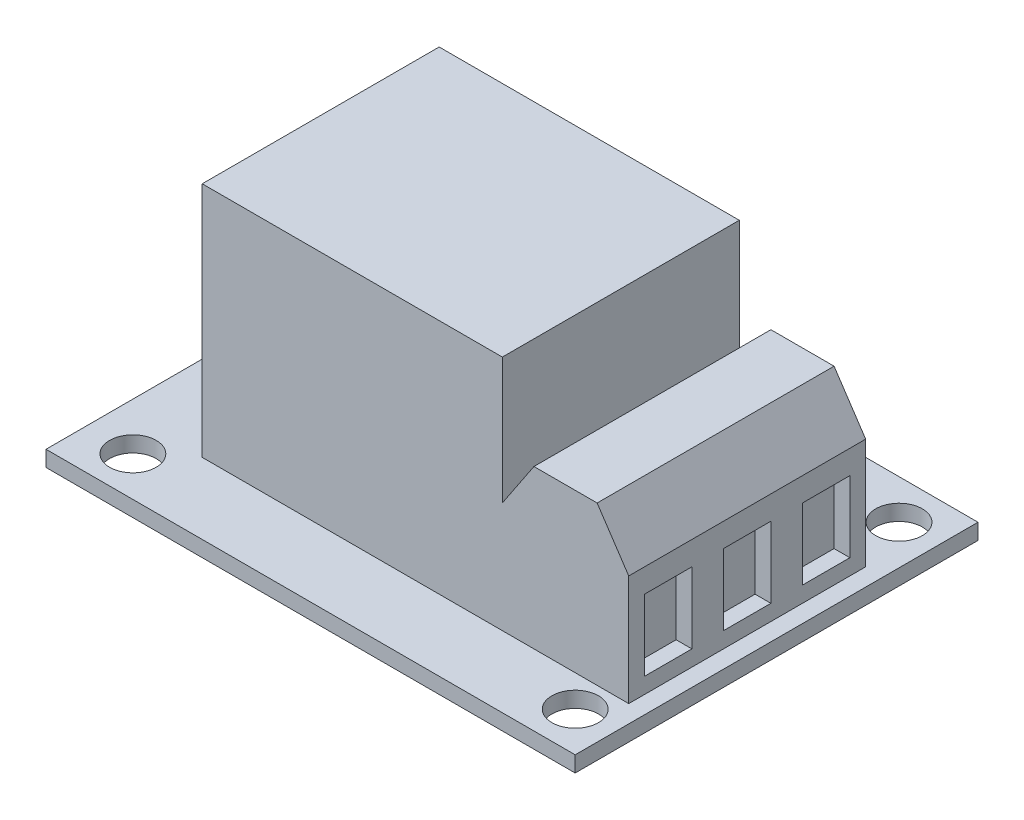
ISO-10303-21;
HEADER;
FILE_DESCRIPTION(('STEP AP214'),'2;1');
FILE_NAME('part.step','',(''),(''),'','','');
FILE_SCHEMA(('AUTOMOTIVE_DESIGN { 1 0 10303 214 1 1 1 1 }'));
ENDSEC;
DATA;
#1=APPLICATION_CONTEXT('core data for automotive mechanical design processes');
#2=APPLICATION_PROTOCOL_DEFINITION('international standard','automotive_design',2000,#1);
#3=PRODUCT_CONTEXT('',#1,'mechanical');
#4=PRODUCT('Part','Part','',(#3));
#5=PRODUCT_RELATED_PRODUCT_CATEGORY('part','',(#4));
#6=PRODUCT_DEFINITION_FORMATION('','',#4);
#7=PRODUCT_DEFINITION_CONTEXT('part definition',#1,'design');
#8=PRODUCT_DEFINITION('design','',#6,#7);
#9=PRODUCT_DEFINITION_SHAPE('','',#8);
#10=(LENGTH_UNIT() NAMED_UNIT(*) SI_UNIT(.MILLI.,.METRE.));
#11=(NAMED_UNIT(*) PLANE_ANGLE_UNIT() SI_UNIT($,.RADIAN.));
#12=(NAMED_UNIT(*) SI_UNIT($,.STERADIAN.) SOLID_ANGLE_UNIT());
#13=UNCERTAINTY_MEASURE_WITH_UNIT(LENGTH_MEASURE(1.E-05),#10,'distance_accuracy_value','');
#14=(GEOMETRIC_REPRESENTATION_CONTEXT(3) GLOBAL_UNCERTAINTY_ASSIGNED_CONTEXT((#13)) GLOBAL_UNIT_ASSIGNED_CONTEXT((#10,
#11,#12)) REPRESENTATION_CONTEXT('',''));
#15=CARTESIAN_POINT('',(0.,0.,0.));
#16=DIRECTION('',(0.,0.,1.));
#17=DIRECTION('',(1.,0.,0.));
#18=AXIS2_PLACEMENT_3D('',#15,#16,#17);
#19=CARTESIAN_POINT('',(11.363042600397,-1.,0.));
#20=DIRECTION('',(-1.,0.,0.));
#21=DIRECTION('',(0.,0.,1.));
#22=AXIS2_PLACEMENT_3D('',#19,#20,#21);
#23=PLANE('',#22);
#24=DIRECTION('',(0.,0.,1.));
#25=VECTOR('',#24,1.);
#26=CARTESIAN_POINT('',(11.363042600397,0.,0.));
#27=LINE('',#26,#25);
#28=CARTESIAN_POINT('',(11.363042600397,0.,-17.0606557377049));
#29=VERTEX_POINT('',#28);
#30=CARTESIAN_POINT('',(11.363042600397,0.,8.43934426229508));
#31=VERTEX_POINT('',#30);
#32=EDGE_CURVE('E454',#29,#31,#27,.T.);
#33=ORIENTED_EDGE('',*,*,#32,.T.);
#34=DIRECTION('',(0.,1.,0.));
#35=VECTOR('',#34,1.);
#36=CARTESIAN_POINT('',(11.363042600397,-1.,8.43934426229508));
#37=LINE('',#36,#35);
#38=CARTESIAN_POINT('',(11.363042600397,-1.,8.43934426229508));
#39=VERTEX_POINT('',#38);
#40=EDGE_CURVE('E468',#39,#31,#37,.T.);
#41=ORIENTED_EDGE('',*,*,#40,.F.);
#42=DIRECTION('',(0.,0.,1.));
#43=VECTOR('',#42,1.);
#44=CARTESIAN_POINT('',(11.363042600397,-1.,0.));
#45=LINE('',#44,#43);
#46=CARTESIAN_POINT('',(11.363042600397,-1.,-17.0606557377049));
#47=VERTEX_POINT('',#46);
#48=EDGE_CURVE('E424',#47,#39,#45,.T.);
#49=ORIENTED_EDGE('',*,*,#48,.F.);
#50=DIRECTION('',(0.,1.,0.));
#51=VECTOR('',#50,1.);
#52=CARTESIAN_POINT('',(11.363042600397,-1.,-17.0606557377049));
#53=LINE('',#52,#51);
#54=EDGE_CURVE('E438',#47,#29,#53,.T.);
#55=ORIENTED_EDGE('',*,*,#54,.T.);
#56=EDGE_LOOP('',(#33,#41,#49,#55));
#57=FACE_BOUND('',#56,.T.);
#58=ADVANCED_FACE('F43',(#57),#23,.F.);
#59=CARTESIAN_POINT('',(0.,-1.,8.43934426229508));
#60=DIRECTION('',(0.,0.,1.));
#61=DIRECTION('',(1.,0.,0.));
#62=AXIS2_PLACEMENT_3D('',#59,#60,#61);
#63=PLANE('',#62);
#64=DIRECTION('',(1.,0.,0.));
#65=VECTOR('',#64,1.);
#66=CARTESIAN_POINT('',(0.,0.,8.43934426229508));
#67=LINE('',#66,#65);
#68=CARTESIAN_POINT('',(-22.136957399603,0.,8.43934426229508));
#69=VERTEX_POINT('',#68);
#70=EDGE_CURVE('E412',#69,#31,#67,.T.);
#71=ORIENTED_EDGE('',*,*,#70,.F.);
#72=DIRECTION('',(0.,1.,0.));
#73=VECTOR('',#72,1.);
#74=CARTESIAN_POINT('',(-22.136957399603,-1.,8.43934426229508));
#75=LINE('',#74,#73);
#76=CARTESIAN_POINT('',(-22.136957399603,-1.,8.43934426229508));
#77=VERTEX_POINT('',#76);
#78=EDGE_CURVE('E472',#77,#69,#75,.T.);
#79=ORIENTED_EDGE('',*,*,#78,.F.);
#80=DIRECTION('',(1.,0.,0.));
#81=VECTOR('',#80,1.);
#82=CARTESIAN_POINT('',(0.,-1.,8.43934426229508));
#83=LINE('',#82,#81);
#84=EDGE_CURVE('E434',#77,#39,#83,.T.);
#85=ORIENTED_EDGE('',*,*,#84,.T.);
#86=ORIENTED_EDGE('',*,*,#40,.T.);
#87=EDGE_LOOP('',(#71,#79,#85,#86));
#88=FACE_BOUND('',#87,.T.);
#89=ADVANCED_FACE('F529',(#88),#63,.T.);
#90=CARTESIAN_POINT('',(-22.136957399603,-1.,0.));
#91=DIRECTION('',(-1.,0.,0.));
#92=DIRECTION('',(0.,0.,1.));
#93=AXIS2_PLACEMENT_3D('',#90,#91,#92);
#94=PLANE('',#93);
#95=DIRECTION('',(0.,0.,1.));
#96=VECTOR('',#95,1.);
#97=CARTESIAN_POINT('',(-22.136957399603,0.,0.));
#98=LINE('',#97,#96);
#99=CARTESIAN_POINT('',(-22.136957399603,0.,-17.0606557377049));
#100=VERTEX_POINT('',#99);
#101=EDGE_CURVE('E461',#100,#69,#98,.T.);
#102=ORIENTED_EDGE('',*,*,#101,.F.);
#103=DIRECTION('',(0.,1.,0.));
#104=VECTOR('',#103,1.);
#105=CARTESIAN_POINT('',(-22.136957399603,-1.,-17.0606557377049));
#106=LINE('',#105,#104);
#107=CARTESIAN_POINT('',(-22.136957399603,-1.,-17.0606557377049));
#108=VERTEX_POINT('',#107);
#109=EDGE_CURVE('E475',#108,#100,#106,.T.);
#110=ORIENTED_EDGE('',*,*,#109,.F.);
#111=DIRECTION('',(0.,0.,1.));
#112=VECTOR('',#111,1.);
#113=CARTESIAN_POINT('',(-22.136957399603,-1.,0.));
#114=LINE('',#113,#112);
#115=EDGE_CURVE('E430',#108,#77,#114,.T.);
#116=ORIENTED_EDGE('',*,*,#115,.T.);
#117=ORIENTED_EDGE('',*,*,#78,.T.);
#118=EDGE_LOOP('',(#102,#110,#116,#117));
#119=FACE_BOUND('',#118,.T.);
#120=ADVANCED_FACE('F535',(#119),#94,.T.);
#121=CARTESIAN_POINT('',(-19.136957399603,-1.,5.93934426229508));
#122=DIRECTION('',(0.,1.,0.));
#123=DIRECTION('',(0.,0.,1.));
#124=AXIS2_PLACEMENT_3D('',#121,#122,#123);
#125=CYLINDRICAL_SURFACE('',#124,1.475);
#126=CARTESIAN_POINT('',(-19.136957399603,-1.,5.93934426229508));
#127=DIRECTION('',(0.,1.,0.));
#128=DIRECTION('',(0.,0.,1.));
#129=AXIS2_PLACEMENT_3D('',#126,#127,#128);
#130=CIRCLE('',#129,1.475);
#131=CARTESIAN_POINT('',(-19.136957399603,-1.,7.41434426229508));
#132=VERTEX_POINT('',#131);
#133=EDGE_CURVE('E420',#132,#132,#130,.T.);
#134=ORIENTED_EDGE('',*,*,#133,.F.);
#135=EDGE_LOOP('',(#134));
#136=FACE_BOUND('',#135,.T.);
#137=CARTESIAN_POINT('',(-19.136957399603,0.,5.93934426229508));
#138=DIRECTION('',(0.,1.,0.));
#139=DIRECTION('',(0.,0.,1.));
#140=AXIS2_PLACEMENT_3D('',#137,#138,#139);
#141=CIRCLE('',#140,1.475);
#142=CARTESIAN_POINT('',(-19.136957399603,0.,7.41434426229508));
#143=VERTEX_POINT('',#142);
#144=EDGE_CURVE('E450',#143,#143,#141,.T.);
#145=ORIENTED_EDGE('',*,*,#144,.T.);
#146=EDGE_LOOP('',(#145));
#147=FACE_BOUND('',#146,.T.);
#148=ADVANCED_FACE('F542',(#136,#147),#125,.F.);
#149=CARTESIAN_POINT('',(-19.136957399603,-1.,-14.5606557377049));
#150=DIRECTION('',(0.,1.,0.));
#151=DIRECTION('',(0.,0.,1.));
#152=AXIS2_PLACEMENT_3D('',#149,#150,#151);
#153=CYLINDRICAL_SURFACE('',#152,1.475);
#154=CARTESIAN_POINT('',(-19.136957399603,-1.,-14.5606557377049));
#155=DIRECTION('',(0.,1.,0.));
#156=DIRECTION('',(0.,0.,1.));
#157=AXIS2_PLACEMENT_3D('',#154,#155,#156);
#158=CIRCLE('',#157,1.475);
#159=CARTESIAN_POINT('',(-19.136957399603,-1.,-13.0856557377049));
#160=VERTEX_POINT('',#159);
#161=EDGE_CURVE('E416',#160,#160,#158,.T.);
#162=ORIENTED_EDGE('',*,*,#161,.F.);
#163=EDGE_LOOP('',(#162));
#164=FACE_BOUND('',#163,.T.);
#165=CARTESIAN_POINT('',(-19.136957399603,0.,-14.5606557377049));
#166=DIRECTION('',(0.,1.,0.));
#167=DIRECTION('',(0.,0.,1.));
#168=AXIS2_PLACEMENT_3D('',#165,#166,#167);
#169=CIRCLE('',#168,1.475);
#170=CARTESIAN_POINT('',(-19.136957399603,0.,-13.0856557377049));
#171=VERTEX_POINT('',#170);
#172=EDGE_CURVE('E446',#171,#171,#169,.T.);
#173=ORIENTED_EDGE('',*,*,#172,.T.);
#174=EDGE_LOOP('',(#173));
#175=FACE_BOUND('',#174,.T.);
#176=ADVANCED_FACE('F545',(#164,#175),#153,.F.);
#177=CARTESIAN_POINT('',(8.86304260039704,-1.,5.93934426229508));
#178=DIRECTION('',(0.,1.,0.));
#179=DIRECTION('',(0.,0.,1.));
#180=AXIS2_PLACEMENT_3D('',#177,#178,#179);
#181=CYLINDRICAL_SURFACE('',#180,1.47500000000108);
#182=CARTESIAN_POINT('',(8.86304260039704,-1.,5.93934426229508));
#183=DIRECTION('',(0.,1.,0.));
#184=DIRECTION('',(0.,0.,1.));
#185=AXIS2_PLACEMENT_3D('',#182,#183,#184);
#186=CIRCLE('',#185,1.47500000000108);
#187=CARTESIAN_POINT('',(8.86304260039704,-1.,7.41434426229616));
#188=VERTEX_POINT('',#187);
#189=EDGE_CURVE('E411',#188,#188,#186,.T.);
#190=ORIENTED_EDGE('',*,*,#189,.F.);
#191=EDGE_LOOP('',(#190));
#192=FACE_BOUND('',#191,.T.);
#193=CARTESIAN_POINT('',(8.86304260039704,0.,5.93934426229508));
#194=DIRECTION('',(0.,1.,0.));
#195=DIRECTION('',(0.,0.,1.));
#196=AXIS2_PLACEMENT_3D('',#193,#194,#195);
#197=CIRCLE('',#196,1.47500000000108);
#198=CARTESIAN_POINT('',(8.86304260039704,0.,7.41434426229616));
#199=VERTEX_POINT('',#198);
#200=EDGE_CURVE('E442',#199,#199,#197,.T.);
#201=ORIENTED_EDGE('',*,*,#200,.T.);
#202=EDGE_LOOP('',(#201));
#203=FACE_BOUND('',#202,.T.);
#204=ADVANCED_FACE('F549',(#192,#203),#181,.F.);
#205=CARTESIAN_POINT('',(8.86304260039704,-1.,-14.5606557377049));
#206=DIRECTION('',(0.,1.,0.));
#207=DIRECTION('',(0.,0.,1.));
#208=AXIS2_PLACEMENT_3D('',#205,#206,#207);
#209=CYLINDRICAL_SURFACE('',#208,1.47500000000085);
#210=CARTESIAN_POINT('',(8.86304260039704,-1.,-14.5606557377049));
#211=DIRECTION('',(0.,1.,0.));
#212=DIRECTION('',(0.,0.,1.));
#213=AXIS2_PLACEMENT_3D('',#210,#211,#212);
#214=CIRCLE('',#213,1.47500000000085);
#215=CARTESIAN_POINT('',(8.86304260039704,-1.,-13.0856557377041));
#216=VERTEX_POINT('',#215);
#217=EDGE_CURVE('E407',#216,#216,#214,.T.);
#218=ORIENTED_EDGE('',*,*,#217,.F.);
#219=EDGE_LOOP('',(#218));
#220=FACE_BOUND('',#219,.T.);
#221=CARTESIAN_POINT('',(8.86304260039704,0.,-14.5606557377049));
#222=DIRECTION('',(0.,1.,0.));
#223=DIRECTION('',(0.,0.,1.));
#224=AXIS2_PLACEMENT_3D('',#221,#222,#223);
#225=CIRCLE('',#224,1.47500000000085);
#226=CARTESIAN_POINT('',(8.86304260039704,0.,-13.0856557377041));
#227=VERTEX_POINT('',#226);
#228=EDGE_CURVE('E406',#227,#227,#225,.T.);
#229=ORIENTED_EDGE('',*,*,#228,.T.);
#230=EDGE_LOOP('',(#229));
#231=FACE_BOUND('',#230,.T.);
#232=ADVANCED_FACE('F552',(#220,#231),#209,.F.);
#233=CARTESIAN_POINT('',(0.,-1.,-17.0606557377049));
#234=DIRECTION('',(0.,0.,1.));
#235=DIRECTION('',(1.,0.,0.));
#236=AXIS2_PLACEMENT_3D('',#233,#234,#235);
#237=PLANE('',#236);
#238=DIRECTION('',(1.,0.,0.));
#239=VECTOR('',#238,1.);
#240=CARTESIAN_POINT('',(0.,0.,-17.0606557377049));
#241=LINE('',#240,#239);
#242=EDGE_CURVE('E458',#100,#29,#241,.T.);
#243=ORIENTED_EDGE('',*,*,#242,.T.);
#244=ORIENTED_EDGE('',*,*,#54,.F.);
#245=DIRECTION('',(1.,0.,0.));
#246=VECTOR('',#245,1.);
#247=CARTESIAN_POINT('',(0.,-1.,-17.0606557377049));
#248=LINE('',#247,#246);
#249=EDGE_CURVE('E427',#108,#47,#248,.T.);
#250=ORIENTED_EDGE('',*,*,#249,.F.);
#251=ORIENTED_EDGE('',*,*,#109,.T.);
#252=EDGE_LOOP('',(#243,#244,#250,#251));
#253=FACE_BOUND('',#252,.T.);
#254=ADVANCED_FACE('F540',(#253),#237,.F.);
#255=CARTESIAN_POINT('',(0.,-1.,0.));
#256=DIRECTION('',(0.,1.,0.));
#257=DIRECTION('',(0.,0.,1.));
#258=AXIS2_PLACEMENT_3D('',#255,#256,#257);
#259=PLANE('',#258);
#260=ORIENTED_EDGE('',*,*,#217,.T.);
#261=EDGE_LOOP('',(#260));
#262=FACE_BOUND('',#261,.T.);
#263=ORIENTED_EDGE('',*,*,#189,.T.);
#264=EDGE_LOOP('',(#263));
#265=FACE_BOUND('',#264,.T.);
#266=ORIENTED_EDGE('',*,*,#161,.T.);
#267=EDGE_LOOP('',(#266));
#268=FACE_BOUND('',#267,.T.);
#269=ORIENTED_EDGE('',*,*,#133,.T.);
#270=EDGE_LOOP('',(#269));
#271=FACE_BOUND('',#270,.T.);
#272=ORIENTED_EDGE('',*,*,#48,.T.);
#273=ORIENTED_EDGE('',*,*,#84,.F.);
#274=ORIENTED_EDGE('',*,*,#115,.F.);
#275=ORIENTED_EDGE('',*,*,#249,.T.);
#276=EDGE_LOOP('',(#272,#273,#274,#275));
#277=FACE_BOUND('',#276,.T.);
#278=ADVANCED_FACE('F559',(#262,#265,#268,#271,#277),#259,.F.);
#279=CARTESIAN_POINT('',(0.,0.,0.));
#280=DIRECTION('',(0.,1.,0.));
#281=DIRECTION('',(0.,0.,1.));
#282=AXIS2_PLACEMENT_3D('',#279,#280,#281);
#283=PLANE('',#282);
#284=DIRECTION('',(-1.,0.,0.));
#285=VECTOR('',#284,1.);
#286=CARTESIAN_POINT('',(0.,0.,3.93934426229508));
#287=LINE('',#286,#285);
#288=CARTESIAN_POINT('',(10.2524590163935,0.,3.93934426229508));
#289=VERTEX_POINT('',#288);
#290=CARTESIAN_POINT('',(-16.7475409836065,0.,3.93934426229509));
#291=VERTEX_POINT('',#290);
#292=EDGE_CURVE('E67',#289,#291,#287,.T.);
#293=ORIENTED_EDGE('',*,*,#292,.T.);
#294=DIRECTION('',(0.,0.,1.));
#295=VECTOR('',#294,1.);
#296=CARTESIAN_POINT('',(-16.7475409836065,0.,0.));
#297=LINE('',#296,#295);
#298=CARTESIAN_POINT('',(-16.7475409836065,0.,-11.0606557377049));
#299=VERTEX_POINT('',#298);
#300=EDGE_CURVE('E236',#299,#291,#297,.T.);
#301=ORIENTED_EDGE('',*,*,#300,.F.);
#302=DIRECTION('',(-1.,0.,0.));
#303=VECTOR('',#302,1.);
#304=CARTESIAN_POINT('',(0.,0.,-11.0606557377049));
#305=LINE('',#304,#303);
#306=CARTESIAN_POINT('',(10.2524590163935,0.,-11.0606557377049));
#307=VERTEX_POINT('',#306);
#308=EDGE_CURVE('E60',#307,#299,#305,.T.);
#309=ORIENTED_EDGE('',*,*,#308,.F.);
#310=DIRECTION('',(0.,0.,1.));
#311=VECTOR('',#310,1.);
#312=CARTESIAN_POINT('',(10.2524590163935,0.,0.));
#313=LINE('',#312,#311);
#314=EDGE_CURVE('E396',#307,#289,#313,.T.);
#315=ORIENTED_EDGE('',*,*,#314,.T.);
#316=EDGE_LOOP('',(#293,#301,#309,#315));
#317=FACE_BOUND('',#316,.T.);
#318=ORIENTED_EDGE('',*,*,#228,.F.);
#319=EDGE_LOOP('',(#318));
#320=FACE_BOUND('',#319,.T.);
#321=ORIENTED_EDGE('',*,*,#200,.F.);
#322=EDGE_LOOP('',(#321));
#323=FACE_BOUND('',#322,.T.);
#324=ORIENTED_EDGE('',*,*,#172,.F.);
#325=EDGE_LOOP('',(#324));
#326=FACE_BOUND('',#325,.T.);
#327=ORIENTED_EDGE('',*,*,#144,.F.);
#328=EDGE_LOOP('',(#327));
#329=FACE_BOUND('',#328,.T.);
#330=ORIENTED_EDGE('',*,*,#32,.F.);
#331=ORIENTED_EDGE('',*,*,#242,.F.);
#332=ORIENTED_EDGE('',*,*,#101,.T.);
#333=ORIENTED_EDGE('',*,*,#70,.T.);
#334=EDGE_LOOP('',(#330,#331,#332,#333));
#335=FACE_BOUND('',#334,.T.);
#336=ADVANCED_FACE('F513',(#317,#320,#323,#326,#329,#335),#283,.T.);
#337=CARTESIAN_POINT('',(0.,10.,3.93934426229508));
#338=DIRECTION('',(0.,0.,1.));
#339=DIRECTION('',(1.,0.,0.));
#340=AXIS2_PLACEMENT_3D('',#337,#338,#339);
#341=PLANE('',#340);
#342=DIRECTION('',(-1.,0.,0.));
#343=VECTOR('',#342,1.);
#344=CARTESIAN_POINT('',(0.,10.,3.93934426229508));
#345=LINE('',#344,#343);
#346=CARTESIAN_POINT('',(8.25245901639345,10.,3.93934426229508));
#347=VERTEX_POINT('',#346);
#348=CARTESIAN_POINT('',(4.25245901639346,10.,3.93934426229508));
#349=VERTEX_POINT('',#348);
#350=EDGE_CURVE('E386',#347,#349,#345,.T.);
#351=ORIENTED_EDGE('',*,*,#350,.T.);
#352=DIRECTION('',(0.554700196225228,0.832050294337844,0.));
#353=VECTOR('',#352,1.);
#354=CARTESIAN_POINT('',(2.9440100882724,8.03732660781841,3.93934426229508));
#355=LINE('',#354,#353);
#356=CARTESIAN_POINT('',(2.25245901639346,6.99999999999999,3.93934426229508));
#357=VERTEX_POINT('',#356);
#358=EDGE_CURVE('E53',#349,#357,#355,.F.);
#359=ORIENTED_EDGE('',*,*,#358,.T.);
#360=DIRECTION('',(0.,-1.,0.));
#361=VECTOR('',#360,1.);
#362=CARTESIAN_POINT('',(2.25245901639346,15.,3.93934426229508));
#363=LINE('',#362,#361);
#364=CARTESIAN_POINT('',(2.25245901639346,15.,3.93934426229508));
#365=VERTEX_POINT('',#364);
#366=EDGE_CURVE('E208',#365,#357,#363,.T.);
#367=ORIENTED_EDGE('',*,*,#366,.F.);
#368=DIRECTION('',(-1.,0.,0.));
#369=VECTOR('',#368,1.);
#370=CARTESIAN_POINT('',(0.,15.,3.93934426229508));
#371=LINE('',#370,#369);
#372=CARTESIAN_POINT('',(-16.7475409836065,15.,3.93934426229509));
#373=VERTEX_POINT('',#372);
#374=EDGE_CURVE('E213',#365,#373,#371,.T.);
#375=ORIENTED_EDGE('',*,*,#374,.T.);
#376=DIRECTION('',(0.,-1.,0.));
#377=VECTOR('',#376,1.);
#378=CARTESIAN_POINT('',(-16.7475409836065,15.,3.93934426229509));
#379=LINE('',#378,#377);
#380=EDGE_CURVE('E245',#373,#291,#379,.T.);
#381=ORIENTED_EDGE('',*,*,#380,.T.);
#382=ORIENTED_EDGE('',*,*,#292,.F.);
#383=DIRECTION('',(0.,-1.,0.));
#384=VECTOR('',#383,1.);
#385=CARTESIAN_POINT('',(10.2524590163935,10.,3.93934426229508));
#386=LINE('',#385,#384);
#387=CARTESIAN_POINT('',(10.2524590163935,6.99999999999998,3.93934426229508));
#388=VERTEX_POINT('',#387);
#389=EDGE_CURVE('E403',#388,#289,#386,.T.);
#390=ORIENTED_EDGE('',*,*,#389,.F.);
#391=DIRECTION('',(0.554700196225228,-0.832050294337844,0.));
#392=VECTOR('',#391,1.);
#393=CARTESIAN_POINT('',(5.71324085750317,13.8088272383354,3.93934426229508));
#394=LINE('',#393,#392);
#395=EDGE_CURVE('E495',#388,#347,#394,.F.);
#396=ORIENTED_EDGE('',*,*,#395,.T.);
#397=EDGE_LOOP('',(#351,#359,#367,#375,#381,#382,#390,#396));
#398=FACE_BOUND('',#397,.T.);
#399=ADVANCED_FACE('F211',(#398),#341,.T.);
#400=CARTESIAN_POINT('',(10.2524590163935,10.,0.));
#401=DIRECTION('',(1.,0.,0.));
#402=DIRECTION('',(0.,0.,-1.));
#403=AXIS2_PLACEMENT_3D('',#400,#401,#402);
#404=PLANE('',#403);
#405=DIRECTION('',(0.,-1.,0.));
#406=VECTOR('',#405,1.);
#407=CARTESIAN_POINT('',(10.2524590163935,5.5,2.93934426229508));
#408=LINE('',#407,#406);
#409=CARTESIAN_POINT('',(10.2524590163935,5.5,2.93934426229508));
#410=VERTEX_POINT('',#409);
#411=CARTESIAN_POINT('',(10.2524590163935,0.999999999999999,2.93934426229508));
#412=VERTEX_POINT('',#411);
#413=EDGE_CURVE('E219',#410,#412,#408,.T.);
#414=ORIENTED_EDGE('',*,*,#413,.F.);
#415=DIRECTION('',(0.,0.,1.));
#416=VECTOR('',#415,1.);
#417=CARTESIAN_POINT('',(10.2524590163935,5.5,2.93934426229508));
#418=LINE('',#417,#416);
#419=CARTESIAN_POINT('',(10.2524590163935,5.5,-0.0606557377049169));
#420=VERTEX_POINT('',#419);
#421=EDGE_CURVE('E306',#420,#410,#418,.T.);
#422=ORIENTED_EDGE('',*,*,#421,.F.);
#423=DIRECTION('',(0.,1.,0.));
#424=VECTOR('',#423,1.);
#425=CARTESIAN_POINT('',(10.2524590163935,5.5,-0.0606557377049169));
#426=LINE('',#425,#424);
#427=CARTESIAN_POINT('',(10.2524590163935,0.999999999999999,-0.0606557377049169));
#428=VERTEX_POINT('',#427);
#429=EDGE_CURVE('E325',#428,#420,#426,.T.);
#430=ORIENTED_EDGE('',*,*,#429,.F.);
#431=DIRECTION('',(0.,0.,-1.));
#432=VECTOR('',#431,1.);
#433=CARTESIAN_POINT('',(10.2524590163935,0.999999999999999,2.93934426229508));
#434=LINE('',#433,#432);
#435=EDGE_CURVE('E321',#412,#428,#434,.T.);
#436=ORIENTED_EDGE('',*,*,#435,.F.);
#437=EDGE_LOOP('',(#414,#422,#430,#436));
#438=FACE_BOUND('',#437,.T.);
#439=DIRECTION('',(0.,-1.,0.));
#440=VECTOR('',#439,1.);
#441=CARTESIAN_POINT('',(10.2524590163935,5.5,-7.06065573770492));
#442=LINE('',#441,#440);
#443=CARTESIAN_POINT('',(10.2524590163935,5.5,-7.06065573770492));
#444=VERTEX_POINT('',#443);
#445=CARTESIAN_POINT('',(10.2524590163935,0.999999999999999,-7.06065573770492));
#446=VERTEX_POINT('',#445);
#447=EDGE_CURVE('E273',#444,#446,#442,.T.);
#448=ORIENTED_EDGE('',*,*,#447,.F.);
#449=DIRECTION('',(0.,0.,1.));
#450=VECTOR('',#449,1.);
#451=CARTESIAN_POINT('',(10.2524590163935,5.5,-7.06065573770492));
#452=LINE('',#451,#450);
#453=CARTESIAN_POINT('',(10.2524590163935,5.5,-10.0606557377049));
#454=VERTEX_POINT('',#453);
#455=EDGE_CURVE('E260',#454,#444,#452,.T.);
#456=ORIENTED_EDGE('',*,*,#455,.F.);
#457=DIRECTION('',(0.,1.,0.));
#458=VECTOR('',#457,1.);
#459=CARTESIAN_POINT('',(10.2524590163935,5.5,-10.0606557377049));
#460=LINE('',#459,#458);
#461=CARTESIAN_POINT('',(10.2524590163935,0.999999999999999,-10.0606557377049));
#462=VERTEX_POINT('',#461);
#463=EDGE_CURVE('E281',#462,#454,#460,.T.);
#464=ORIENTED_EDGE('',*,*,#463,.F.);
#465=DIRECTION('',(0.,0.,-1.));
#466=VECTOR('',#465,1.);
#467=CARTESIAN_POINT('',(10.2524590163935,0.999999999999999,-7.06065573770492));
#468=LINE('',#467,#466);
#469=EDGE_CURVE('E276',#446,#462,#468,.T.);
#470=ORIENTED_EDGE('',*,*,#469,.F.);
#471=EDGE_LOOP('',(#448,#456,#464,#470));
#472=FACE_BOUND('',#471,.T.);
#473=DIRECTION('',(0.,-1.,0.));
#474=VECTOR('',#473,1.);
#475=CARTESIAN_POINT('',(10.2524590163935,5.5,-2.06065573770492));
#476=LINE('',#475,#474);
#477=CARTESIAN_POINT('',(10.2524590163935,5.5,-2.06065573770492));
#478=VERTEX_POINT('',#477);
#479=CARTESIAN_POINT('',(10.2524590163935,0.999999999999999,-2.06065573770492));
#480=VERTEX_POINT('',#479);
#481=EDGE_CURVE('E291',#478,#480,#476,.T.);
#482=ORIENTED_EDGE('',*,*,#481,.F.);
#483=DIRECTION('',(0.,0.,1.));
#484=VECTOR('',#483,1.);
#485=CARTESIAN_POINT('',(10.2524590163935,5.5,-2.06065573770492));
#486=LINE('',#485,#484);
#487=CARTESIAN_POINT('',(10.2524590163935,5.5,-5.06065573770492));
#488=VERTEX_POINT('',#487);
#489=EDGE_CURVE('E348',#488,#478,#486,.T.);
#490=ORIENTED_EDGE('',*,*,#489,.F.);
#491=DIRECTION('',(0.,1.,0.));
#492=VECTOR('',#491,1.);
#493=CARTESIAN_POINT('',(10.2524590163935,5.5,-5.06065573770492));
#494=LINE('',#493,#492);
#495=CARTESIAN_POINT('',(10.2524590163935,0.999999999999999,-5.06065573770492));
#496=VERTEX_POINT('',#495);
#497=EDGE_CURVE('E367',#496,#488,#494,.T.);
#498=ORIENTED_EDGE('',*,*,#497,.F.);
#499=DIRECTION('',(0.,0.,-1.));
#500=VECTOR('',#499,1.);
#501=CARTESIAN_POINT('',(10.2524590163935,0.999999999999999,-2.06065573770492));
#502=LINE('',#501,#500);
#503=EDGE_CURVE('E363',#480,#496,#502,.T.);
#504=ORIENTED_EDGE('',*,*,#503,.F.);
#505=EDGE_LOOP('',(#482,#490,#498,#504));
#506=FACE_BOUND('',#505,.T.);
#507=DIRECTION('',(0.,-1.,0.));
#508=VECTOR('',#507,1.);
#509=CARTESIAN_POINT('',(10.2524590163935,10.,-11.0606557377049));
#510=LINE('',#509,#508);
#511=CARTESIAN_POINT('',(10.2524590163935,6.99999999999998,-11.0606557377049));
#512=VERTEX_POINT('',#511);
#513=EDGE_CURVE('E393',#512,#307,#510,.T.);
#514=ORIENTED_EDGE('',*,*,#513,.F.);
#515=DIRECTION('',(0.,0.,1.));
#516=VECTOR('',#515,1.);
#517=CARTESIAN_POINT('',(10.2524590163935,6.99999999999998,0.));
#518=LINE('',#517,#516);
#519=EDGE_CURVE('E11',#512,#388,#518,.T.);
#520=ORIENTED_EDGE('',*,*,#519,.T.);
#521=ORIENTED_EDGE('',*,*,#389,.T.);
#522=ORIENTED_EDGE('',*,*,#314,.F.);
#523=EDGE_LOOP('',(#514,#520,#521,#522));
#524=FACE_BOUND('',#523,.T.);
#525=ADVANCED_FACE('F512',(#438,#472,#506,#524),#404,.T.);
#526=CARTESIAN_POINT('',(0.,10.,-11.0606557377049));
#527=DIRECTION('',(0.,0.,1.));
#528=DIRECTION('',(1.,0.,0.));
#529=AXIS2_PLACEMENT_3D('',#526,#527,#528);
#530=PLANE('',#529);
#531=ORIENTED_EDGE('',*,*,#308,.T.);
#532=DIRECTION('',(0.,-1.,0.));
#533=VECTOR('',#532,1.);
#534=CARTESIAN_POINT('',(-16.7475409836065,15.,-11.0606557377049));
#535=LINE('',#534,#533);
#536=CARTESIAN_POINT('',(-16.7475409836065,15.,-11.0606557377049));
#537=VERTEX_POINT('',#536);
#538=EDGE_CURVE('E249',#537,#299,#535,.T.);
#539=ORIENTED_EDGE('',*,*,#538,.F.);
#540=DIRECTION('',(-1.,0.,0.));
#541=VECTOR('',#540,1.);
#542=CARTESIAN_POINT('',(0.,15.,-11.0606557377049));
#543=LINE('',#542,#541);
#544=CARTESIAN_POINT('',(2.25245901639346,15.,-11.0606557377049));
#545=VERTEX_POINT('',#544);
#546=EDGE_CURVE('E229',#545,#537,#543,.T.);
#547=ORIENTED_EDGE('',*,*,#546,.F.);
#548=DIRECTION('',(0.,-1.,0.));
#549=VECTOR('',#548,1.);
#550=CARTESIAN_POINT('',(2.25245901639346,15.,-11.0606557377049));
#551=LINE('',#550,#549);
#552=CARTESIAN_POINT('',(2.25245901639346,6.99999999999999,-11.0606557377049));
#553=VERTEX_POINT('',#552);
#554=EDGE_CURVE('E220',#545,#553,#551,.T.);
#555=ORIENTED_EDGE('',*,*,#554,.T.);
#556=DIRECTION('',(-0.554700196225228,-0.832050294337844,0.));
#557=VECTOR('',#556,1.);
#558=CARTESIAN_POINT('',(2.25245901639346,6.99999999999999,-11.0606557377049));
#559=LINE('',#558,#557);
#560=CARTESIAN_POINT('',(4.25245901639346,10.,-11.0606557377049));
#561=VERTEX_POINT('',#560);
#562=EDGE_CURVE('E486',#553,#561,#559,.F.);
#563=ORIENTED_EDGE('',*,*,#562,.T.);
#564=DIRECTION('',(-1.,0.,0.));
#565=VECTOR('',#564,1.);
#566=CARTESIAN_POINT('',(0.,10.,-11.0606557377049));
#567=LINE('',#566,#565);
#568=CARTESIAN_POINT('',(8.25245901639345,10.,-11.0606557377049));
#569=VERTEX_POINT('',#568);
#570=EDGE_CURVE('E389',#569,#561,#567,.T.);
#571=ORIENTED_EDGE('',*,*,#570,.F.);
#572=DIRECTION('',(-0.554700196225228,0.832050294337844,0.));
#573=VECTOR('',#572,1.);
#574=CARTESIAN_POINT('',(10.2524590163935,6.99999999999999,-11.0606557377049));
#575=LINE('',#574,#573);
#576=EDGE_CURVE('E483',#569,#512,#575,.F.);
#577=ORIENTED_EDGE('',*,*,#576,.T.);
#578=ORIENTED_EDGE('',*,*,#513,.T.);
#579=EDGE_LOOP('',(#531,#539,#547,#555,#563,#571,#577,#578));
#580=FACE_BOUND('',#579,.T.);
#581=ADVANCED_FACE('F509',(#580),#530,.F.);
#582=CARTESIAN_POINT('',(0.,10.,0.));
#583=DIRECTION('',(0.,1.,0.));
#584=DIRECTION('',(0.,0.,1.));
#585=AXIS2_PLACEMENT_3D('',#582,#583,#584);
#586=PLANE('',#585);
#587=ORIENTED_EDGE('',*,*,#570,.T.);
#588=DIRECTION('',(0.,0.,1.));
#589=VECTOR('',#588,1.);
#590=CARTESIAN_POINT('',(4.25245901639346,10.,0.));
#591=LINE('',#590,#589);
#592=EDGE_CURVE('E492',#561,#349,#591,.T.);
#593=ORIENTED_EDGE('',*,*,#592,.T.);
#594=ORIENTED_EDGE('',*,*,#350,.F.);
#595=DIRECTION('',(0.,0.,-1.));
#596=VECTOR('',#595,1.);
#597=CARTESIAN_POINT('',(8.25245901639345,10.,0.));
#598=LINE('',#597,#596);
#599=EDGE_CURVE('E489',#347,#569,#598,.T.);
#600=ORIENTED_EDGE('',*,*,#599,.T.);
#601=EDGE_LOOP('',(#587,#593,#594,#600));
#602=FACE_BOUND('',#601,.T.);
#603=ADVANCED_FACE('F504',(#602),#586,.T.);
#604=CARTESIAN_POINT('',(2.25245901639346,6.99999999999999,0.));
#605=DIRECTION('',(0.832050294337844,-0.554700196225228,0.));
#606=DIRECTION('',(0.,0.,-1.));
#607=AXIS2_PLACEMENT_3D('',#604,#605,#606);
#608=PLANE('',#607);
#609=ORIENTED_EDGE('',*,*,#358,.F.);
#610=ORIENTED_EDGE('',*,*,#592,.F.);
#611=ORIENTED_EDGE('',*,*,#562,.F.);
#612=DIRECTION('',(0.,0.,-1.));
#613=VECTOR('',#612,1.);
#614=CARTESIAN_POINT('',(2.25245901639346,6.99999999999999,0.));
#615=LINE('',#614,#613);
#616=EDGE_CURVE('E471',#357,#553,#615,.T.);
#617=ORIENTED_EDGE('',*,*,#616,.F.);
#618=EDGE_LOOP('',(#609,#610,#611,#617));
#619=FACE_BOUND('',#618,.T.);
#620=ADVANCED_FACE('F518',(#619),#608,.F.);
#621=CARTESIAN_POINT('',(10.2524590163935,6.99999999999998,0.));
#622=DIRECTION('',(-0.832050294337844,-0.554700196225228,0.));
#623=DIRECTION('',(0.,0.,1.));
#624=AXIS2_PLACEMENT_3D('',#621,#622,#623);
#625=PLANE('',#624);
#626=ORIENTED_EDGE('',*,*,#576,.F.);
#627=ORIENTED_EDGE('',*,*,#599,.F.);
#628=ORIENTED_EDGE('',*,*,#395,.F.);
#629=ORIENTED_EDGE('',*,*,#519,.F.);
#630=EDGE_LOOP('',(#626,#627,#628,#629));
#631=FACE_BOUND('',#630,.T.);
#632=ADVANCED_FACE('F46',(#631),#625,.F.);
#633=CARTESIAN_POINT('',(9.25245901639346,5.5,-2.06065573770492));
#634=DIRECTION('',(0.,0.,1.));
#635=DIRECTION('',(0.,-1.,0.));
#636=AXIS2_PLACEMENT_3D('',#633,#634,#635);
#637=PLANE('',#636);
#638=ORIENTED_EDGE('',*,*,#481,.T.);
#639=DIRECTION('',(1.,0.,0.));
#640=VECTOR('',#639,1.);
#641=CARTESIAN_POINT('',(9.25245901639346,0.999999999999999,-2.06065573770492));
#642=LINE('',#641,#640);
#643=CARTESIAN_POINT('',(9.25245901639346,0.999999999999999,-2.06065573770492));
#644=VERTEX_POINT('',#643);
#645=EDGE_CURVE('E360',#644,#480,#642,.T.);
#646=ORIENTED_EDGE('',*,*,#645,.F.);
#647=DIRECTION('',(0.,-1.,0.));
#648=VECTOR('',#647,1.);
#649=CARTESIAN_POINT('',(9.25245901639346,5.5,-2.06065573770492));
#650=LINE('',#649,#648);
#651=CARTESIAN_POINT('',(9.25245901639346,5.5,-2.06065573770492));
#652=VERTEX_POINT('',#651);
#653=EDGE_CURVE('E343',#652,#644,#650,.T.);
#654=ORIENTED_EDGE('',*,*,#653,.F.);
#655=DIRECTION('',(1.,0.,0.));
#656=VECTOR('',#655,1.);
#657=CARTESIAN_POINT('',(9.25245901639346,5.5,-2.06065573770492));
#658=LINE('',#657,#656);
#659=EDGE_CURVE('E374',#652,#478,#658,.T.);
#660=ORIENTED_EDGE('',*,*,#659,.T.);
#661=EDGE_LOOP('',(#638,#646,#654,#660));
#662=FACE_BOUND('',#661,.T.);
#663=ADVANCED_FACE('F524',(#662),#637,.F.);
#664=CARTESIAN_POINT('',(9.25245901639346,5.5,-2.06065573770492));
#665=DIRECTION('',(0.,1.,0.));
#666=DIRECTION('',(0.,0.,1.));
#667=AXIS2_PLACEMENT_3D('',#664,#665,#666);
#668=PLANE('',#667);
#669=ORIENTED_EDGE('',*,*,#489,.T.);
#670=ORIENTED_EDGE('',*,*,#659,.F.);
#671=DIRECTION('',(0.,0.,1.));
#672=VECTOR('',#671,1.);
#673=CARTESIAN_POINT('',(9.25245901639346,5.5,-2.06065573770492));
#674=LINE('',#673,#672);
#675=CARTESIAN_POINT('',(9.25245901639346,5.5,-5.06065573770492));
#676=VERTEX_POINT('',#675);
#677=EDGE_CURVE('E356',#676,#652,#674,.T.);
#678=ORIENTED_EDGE('',*,*,#677,.F.);
#679=DIRECTION('',(1.,0.,0.));
#680=VECTOR('',#679,1.);
#681=CARTESIAN_POINT('',(9.25245901639346,5.5,-5.06065573770492));
#682=LINE('',#681,#680);
#683=EDGE_CURVE('E377',#676,#488,#682,.T.);
#684=ORIENTED_EDGE('',*,*,#683,.T.);
#685=EDGE_LOOP('',(#669,#670,#678,#684));
#686=FACE_BOUND('',#685,.T.);
#687=ADVANCED_FACE('F659',(#686),#668,.F.);
#688=CARTESIAN_POINT('',(9.25245901639346,5.5,-5.06065573770492));
#689=DIRECTION('',(0.,0.,-1.));
#690=DIRECTION('',(0.,1.,0.));
#691=AXIS2_PLACEMENT_3D('',#688,#689,#690);
#692=PLANE('',#691);
#693=ORIENTED_EDGE('',*,*,#497,.T.);
#694=ORIENTED_EDGE('',*,*,#683,.F.);
#695=DIRECTION('',(0.,1.,0.));
#696=VECTOR('',#695,1.);
#697=CARTESIAN_POINT('',(9.25245901639346,5.5,-5.06065573770492));
#698=LINE('',#697,#696);
#699=CARTESIAN_POINT('',(9.25245901639346,0.999999999999999,-5.06065573770492));
#700=VERTEX_POINT('',#699);
#701=EDGE_CURVE('E352',#700,#676,#698,.T.);
#702=ORIENTED_EDGE('',*,*,#701,.F.);
#703=DIRECTION('',(1.,0.,0.));
#704=VECTOR('',#703,1.);
#705=CARTESIAN_POINT('',(9.25245901639346,0.999999999999999,-5.06065573770492));
#706=LINE('',#705,#704);
#707=EDGE_CURVE('E380',#700,#496,#706,.T.);
#708=ORIENTED_EDGE('',*,*,#707,.T.);
#709=EDGE_LOOP('',(#693,#694,#702,#708));
#710=FACE_BOUND('',#709,.T.);
#711=ADVANCED_FACE('F669',(#710),#692,.F.);
#712=CARTESIAN_POINT('',(9.25245901639346,0.999999999999999,-2.06065573770492));
#713=DIRECTION('',(0.,-1.,0.));
#714=DIRECTION('',(0.,0.,-1.));
#715=AXIS2_PLACEMENT_3D('',#712,#713,#714);
#716=PLANE('',#715);
#717=ORIENTED_EDGE('',*,*,#503,.T.);
#718=ORIENTED_EDGE('',*,*,#707,.F.);
#719=DIRECTION('',(0.,0.,-1.));
#720=VECTOR('',#719,1.);
#721=CARTESIAN_POINT('',(9.25245901639346,0.999999999999999,-2.06065573770492));
#722=LINE('',#721,#720);
#723=EDGE_CURVE('E347',#644,#700,#722,.T.);
#724=ORIENTED_EDGE('',*,*,#723,.F.);
#725=ORIENTED_EDGE('',*,*,#645,.T.);
#726=EDGE_LOOP('',(#717,#718,#724,#725));
#727=FACE_BOUND('',#726,.T.);
#728=ADVANCED_FACE('F679',(#727),#716,.F.);
#729=CARTESIAN_POINT('',(9.25245901639346,0.,0.));
#730=DIRECTION('',(1.,0.,0.));
#731=DIRECTION('',(0.,0.,-1.));
#732=AXIS2_PLACEMENT_3D('',#729,#730,#731);
#733=PLANE('',#732);
#734=ORIENTED_EDGE('',*,*,#653,.T.);
#735=ORIENTED_EDGE('',*,*,#723,.T.);
#736=ORIENTED_EDGE('',*,*,#701,.T.);
#737=ORIENTED_EDGE('',*,*,#677,.T.);
#738=EDGE_LOOP('',(#734,#735,#736,#737));
#739=FACE_BOUND('',#738,.T.);
#740=ADVANCED_FACE('F689',(#739),#733,.T.);
#741=CARTESIAN_POINT('',(9.25245901639345,5.5,-7.06065573770492));
#742=DIRECTION('',(0.,0.,1.));
#743=DIRECTION('',(0.,-1.,0.));
#744=AXIS2_PLACEMENT_3D('',#741,#742,#743);
#745=PLANE('',#744);
#746=ORIENTED_EDGE('',*,*,#447,.T.);
#747=DIRECTION('',(1.,0.,0.));
#748=VECTOR('',#747,1.);
#749=CARTESIAN_POINT('',(9.25245901639345,0.999999999999999,-7.06065573770492));
#750=LINE('',#749,#748);
#751=CARTESIAN_POINT('',(9.25245901639345,0.999999999999999,-7.06065573770492));
#752=VERTEX_POINT('',#751);
#753=EDGE_CURVE('E272',#752,#446,#750,.T.);
#754=ORIENTED_EDGE('',*,*,#753,.F.);
#755=DIRECTION('',(0.,-1.,0.));
#756=VECTOR('',#755,1.);
#757=CARTESIAN_POINT('',(9.25245901639345,5.5,-7.06065573770492));
#758=LINE('',#757,#756);
#759=CARTESIAN_POINT('',(9.25245901639345,5.5,-7.06065573770492));
#760=VERTEX_POINT('',#759);
#761=EDGE_CURVE('E255',#760,#752,#758,.T.);
#762=ORIENTED_EDGE('',*,*,#761,.F.);
#763=DIRECTION('',(1.,0.,0.));
#764=VECTOR('',#763,1.);
#765=CARTESIAN_POINT('',(9.25245901639345,5.5,-7.06065573770492));
#766=LINE('',#765,#764);
#767=EDGE_CURVE('E288',#760,#444,#766,.T.);
#768=ORIENTED_EDGE('',*,*,#767,.T.);
#769=EDGE_LOOP('',(#746,#754,#762,#768));
#770=FACE_BOUND('',#769,.T.);
#771=ADVANCED_FACE('F699',(#770),#745,.F.);
#772=CARTESIAN_POINT('',(9.25245901639345,5.5,-7.06065573770492));
#773=DIRECTION('',(0.,1.,0.));
#774=DIRECTION('',(0.,0.,1.));
#775=AXIS2_PLACEMENT_3D('',#772,#773,#774);
#776=PLANE('',#775);
#777=ORIENTED_EDGE('',*,*,#455,.T.);
#778=ORIENTED_EDGE('',*,*,#767,.F.);
#779=DIRECTION('',(0.,0.,1.));
#780=VECTOR('',#779,1.);
#781=CARTESIAN_POINT('',(9.25245901639345,5.5,-7.06065573770492));
#782=LINE('',#781,#780);
#783=CARTESIAN_POINT('',(9.25245901639345,5.5,-10.0606557377049));
#784=VERTEX_POINT('',#783);
#785=EDGE_CURVE('E268',#784,#760,#782,.T.);
#786=ORIENTED_EDGE('',*,*,#785,.F.);
#787=DIRECTION('',(1.,0.,0.));
#788=VECTOR('',#787,1.);
#789=CARTESIAN_POINT('',(9.25245901639345,5.5,-10.0606557377049));
#790=LINE('',#789,#788);
#791=EDGE_CURVE('E292',#784,#454,#790,.T.);
#792=ORIENTED_EDGE('',*,*,#791,.T.);
#793=EDGE_LOOP('',(#777,#778,#786,#792));
#794=FACE_BOUND('',#793,.T.);
#795=ADVANCED_FACE('F709',(#794),#776,.F.);
#796=CARTESIAN_POINT('',(9.25245901639345,5.5,-10.0606557377049));
#797=DIRECTION('',(0.,0.,-1.));
#798=DIRECTION('',(-1.,0.,0.));
#799=AXIS2_PLACEMENT_3D('',#796,#797,#798);
#800=PLANE('',#799);
#801=ORIENTED_EDGE('',*,*,#463,.T.);
#802=ORIENTED_EDGE('',*,*,#791,.F.);
#803=DIRECTION('',(0.,1.,0.));
#804=VECTOR('',#803,1.);
#805=CARTESIAN_POINT('',(9.25245901639345,5.5,-10.0606557377049));
#806=LINE('',#805,#804);
#807=CARTESIAN_POINT('',(9.25245901639345,0.999999999999999,-10.0606557377049));
#808=VERTEX_POINT('',#807);
#809=EDGE_CURVE('E264',#808,#784,#806,.T.);
#810=ORIENTED_EDGE('',*,*,#809,.F.);
#811=DIRECTION('',(1.,0.,0.));
#812=VECTOR('',#811,1.);
#813=CARTESIAN_POINT('',(9.25245901639345,0.999999999999999,-10.0606557377049));
#814=LINE('',#813,#812);
#815=EDGE_CURVE('E295',#808,#462,#814,.T.);
#816=ORIENTED_EDGE('',*,*,#815,.T.);
#817=EDGE_LOOP('',(#801,#802,#810,#816));
#818=FACE_BOUND('',#817,.T.);
#819=ADVANCED_FACE('F719',(#818),#800,.F.);
#820=CARTESIAN_POINT('',(9.25245901639345,0.999999999999999,-7.06065573770492));
#821=DIRECTION('',(0.,-1.,0.));
#822=DIRECTION('',(0.,0.,-1.));
#823=AXIS2_PLACEMENT_3D('',#820,#821,#822);
#824=PLANE('',#823);
#825=ORIENTED_EDGE('',*,*,#469,.T.);
#826=ORIENTED_EDGE('',*,*,#815,.F.);
#827=DIRECTION('',(0.,0.,-1.));
#828=VECTOR('',#827,1.);
#829=CARTESIAN_POINT('',(9.25245901639345,0.999999999999999,-7.06065573770492));
#830=LINE('',#829,#828);
#831=EDGE_CURVE('E259',#752,#808,#830,.T.);
#832=ORIENTED_EDGE('',*,*,#831,.F.);
#833=ORIENTED_EDGE('',*,*,#753,.T.);
#834=EDGE_LOOP('',(#825,#826,#832,#833));
#835=FACE_BOUND('',#834,.T.);
#836=ADVANCED_FACE('F729',(#835),#824,.F.);
#837=CARTESIAN_POINT('',(9.25245901639345,0.,0.));
#838=DIRECTION('',(1.,0.,0.));
#839=DIRECTION('',(0.,0.,-1.));
#840=AXIS2_PLACEMENT_3D('',#837,#838,#839);
#841=PLANE('',#840);
#842=ORIENTED_EDGE('',*,*,#761,.T.);
#843=ORIENTED_EDGE('',*,*,#831,.T.);
#844=ORIENTED_EDGE('',*,*,#809,.T.);
#845=ORIENTED_EDGE('',*,*,#785,.T.);
#846=EDGE_LOOP('',(#842,#843,#844,#845));
#847=FACE_BOUND('',#846,.T.);
#848=ADVANCED_FACE('F739',(#847),#841,.T.);
#849=CARTESIAN_POINT('',(9.25245901639346,5.5,2.93934426229508));
#850=DIRECTION('',(0.,0.,1.));
#851=DIRECTION('',(1.,0.,0.));
#852=AXIS2_PLACEMENT_3D('',#849,#850,#851);
#853=PLANE('',#852);
#854=ORIENTED_EDGE('',*,*,#413,.T.);
#855=DIRECTION('',(1.,0.,0.));
#856=VECTOR('',#855,1.);
#857=CARTESIAN_POINT('',(9.25245901639346,0.999999999999999,2.93934426229508));
#858=LINE('',#857,#856);
#859=CARTESIAN_POINT('',(9.25245901639346,0.999999999999999,2.93934426229508));
#860=VERTEX_POINT('',#859);
#861=EDGE_CURVE('E318',#860,#412,#858,.T.);
#862=ORIENTED_EDGE('',*,*,#861,.F.);
#863=DIRECTION('',(0.,-1.,0.));
#864=VECTOR('',#863,1.);
#865=CARTESIAN_POINT('',(9.25245901639346,5.5,2.93934426229508));
#866=LINE('',#865,#864);
#867=CARTESIAN_POINT('',(9.25245901639346,5.5,2.93934426229508));
#868=VERTEX_POINT('',#867);
#869=EDGE_CURVE('E301',#868,#860,#866,.T.);
#870=ORIENTED_EDGE('',*,*,#869,.F.);
#871=DIRECTION('',(1.,0.,0.));
#872=VECTOR('',#871,1.);
#873=CARTESIAN_POINT('',(9.25245901639346,5.5,2.93934426229508));
#874=LINE('',#873,#872);
#875=EDGE_CURVE('E277',#868,#410,#874,.T.);
#876=ORIENTED_EDGE('',*,*,#875,.T.);
#877=EDGE_LOOP('',(#854,#862,#870,#876));
#878=FACE_BOUND('',#877,.T.);
#879=ADVANCED_FACE('F749',(#878),#853,.F.);
#880=CARTESIAN_POINT('',(9.25245901639346,5.5,2.93934426229508));
#881=DIRECTION('',(0.,1.,0.));
#882=DIRECTION('',(0.,0.,1.));
#883=AXIS2_PLACEMENT_3D('',#880,#881,#882);
#884=PLANE('',#883);
#885=ORIENTED_EDGE('',*,*,#421,.T.);
#886=ORIENTED_EDGE('',*,*,#875,.F.);
#887=DIRECTION('',(0.,0.,1.));
#888=VECTOR('',#887,1.);
#889=CARTESIAN_POINT('',(9.25245901639346,5.5,2.93934426229508));
#890=LINE('',#889,#888);
#891=CARTESIAN_POINT('',(9.25245901639346,5.5,-0.0606557377049167));
#892=VERTEX_POINT('',#891);
#893=EDGE_CURVE('E314',#892,#868,#890,.T.);
#894=ORIENTED_EDGE('',*,*,#893,.F.);
#895=DIRECTION('',(1.,0.,0.));
#896=VECTOR('',#895,1.);
#897=CARTESIAN_POINT('',(9.25245901639346,5.5,-0.0606557377049167));
#898=LINE('',#897,#896);
#899=EDGE_CURVE('E334',#892,#420,#898,.T.);
#900=ORIENTED_EDGE('',*,*,#899,.T.);
#901=EDGE_LOOP('',(#885,#886,#894,#900));
#902=FACE_BOUND('',#901,.T.);
#903=ADVANCED_FACE('F759',(#902),#884,.F.);
#904=CARTESIAN_POINT('',(9.25245901639346,5.5,-0.0606557377049167));
#905=DIRECTION('',(0.,0.,-1.));
#906=DIRECTION('',(-1.,0.,0.));
#907=AXIS2_PLACEMENT_3D('',#904,#905,#906);
#908=PLANE('',#907);
#909=ORIENTED_EDGE('',*,*,#429,.T.);
#910=ORIENTED_EDGE('',*,*,#899,.F.);
#911=DIRECTION('',(0.,1.,0.));
#912=VECTOR('',#911,1.);
#913=CARTESIAN_POINT('',(9.25245901639346,5.5,-0.0606557377049167));
#914=LINE('',#913,#912);
#915=CARTESIAN_POINT('',(9.25245901639346,0.999999999999999,-0.0606557377049167));
#916=VERTEX_POINT('',#915);
#917=EDGE_CURVE('E310',#916,#892,#914,.T.);
#918=ORIENTED_EDGE('',*,*,#917,.F.);
#919=DIRECTION('',(1.,0.,0.));
#920=VECTOR('',#919,1.);
#921=CARTESIAN_POINT('',(9.25245901639346,0.999999999999999,-0.0606557377049167));
#922=LINE('',#921,#920);
#923=EDGE_CURVE('E337',#916,#428,#922,.T.);
#924=ORIENTED_EDGE('',*,*,#923,.T.);
#925=EDGE_LOOP('',(#909,#910,#918,#924));
#926=FACE_BOUND('',#925,.T.);
#927=ADVANCED_FACE('F769',(#926),#908,.F.);
#928=CARTESIAN_POINT('',(9.25245901639346,0.999999999999999,2.93934426229508));
#929=DIRECTION('',(0.,-1.,0.));
#930=DIRECTION('',(0.,0.,-1.));
#931=AXIS2_PLACEMENT_3D('',#928,#929,#930);
#932=PLANE('',#931);
#933=ORIENTED_EDGE('',*,*,#435,.T.);
#934=ORIENTED_EDGE('',*,*,#923,.F.);
#935=DIRECTION('',(0.,0.,-1.));
#936=VECTOR('',#935,1.);
#937=CARTESIAN_POINT('',(9.25245901639346,0.999999999999999,2.93934426229508));
#938=LINE('',#937,#936);
#939=EDGE_CURVE('E305',#860,#916,#938,.T.);
#940=ORIENTED_EDGE('',*,*,#939,.F.);
#941=ORIENTED_EDGE('',*,*,#861,.T.);
#942=EDGE_LOOP('',(#933,#934,#940,#941));
#943=FACE_BOUND('',#942,.T.);
#944=ADVANCED_FACE('F779',(#943),#932,.F.);
#945=CARTESIAN_POINT('',(9.25245901639346,0.,0.));
#946=DIRECTION('',(1.,0.,0.));
#947=DIRECTION('',(0.,0.,-1.));
#948=AXIS2_PLACEMENT_3D('',#945,#946,#947);
#949=PLANE('',#948);
#950=ORIENTED_EDGE('',*,*,#869,.T.);
#951=ORIENTED_EDGE('',*,*,#939,.T.);
#952=ORIENTED_EDGE('',*,*,#917,.T.);
#953=ORIENTED_EDGE('',*,*,#893,.T.);
#954=EDGE_LOOP('',(#950,#951,#952,#953));
#955=FACE_BOUND('',#954,.T.);
#956=ADVANCED_FACE('F789',(#955),#949,.T.);
#957=CARTESIAN_POINT('',(2.25245901639346,15.,0.));
#958=DIRECTION('',(-1.,0.,0.));
#959=DIRECTION('',(0.,0.,1.));
#960=AXIS2_PLACEMENT_3D('',#957,#958,#959);
#961=PLANE('',#960);
#962=ORIENTED_EDGE('',*,*,#616,.T.);
#963=ORIENTED_EDGE('',*,*,#554,.F.);
#964=DIRECTION('',(0.,0.,-1.));
#965=VECTOR('',#964,1.);
#966=CARTESIAN_POINT('',(2.25245901639346,15.,0.));
#967=LINE('',#966,#965);
#968=EDGE_CURVE('E223',#365,#545,#967,.T.);
#969=ORIENTED_EDGE('',*,*,#968,.F.);
#970=ORIENTED_EDGE('',*,*,#366,.T.);
#971=EDGE_LOOP('',(#962,#963,#969,#970));
#972=FACE_BOUND('',#971,.T.);
#973=ADVANCED_FACE('F224',(#972),#961,.F.);
#974=CARTESIAN_POINT('',(-16.7475409836065,15.,0.));
#975=DIRECTION('',(1.,0.,0.));
#976=DIRECTION('',(0.,0.,-1.));
#977=AXIS2_PLACEMENT_3D('',#974,#975,#976);
#978=PLANE('',#977);
#979=ORIENTED_EDGE('',*,*,#300,.T.);
#980=ORIENTED_EDGE('',*,*,#380,.F.);
#981=DIRECTION('',(0.,0.,1.));
#982=VECTOR('',#981,1.);
#983=CARTESIAN_POINT('',(-16.7475409836065,15.,0.));
#984=LINE('',#983,#982);
#985=EDGE_CURVE('E233',#537,#373,#984,.T.);
#986=ORIENTED_EDGE('',*,*,#985,.F.);
#987=ORIENTED_EDGE('',*,*,#538,.T.);
#988=EDGE_LOOP('',(#979,#980,#986,#987));
#989=FACE_BOUND('',#988,.T.);
#990=ADVANCED_FACE('F516',(#989),#978,.F.);
#991=CARTESIAN_POINT('',(0.,15.,0.));
#992=DIRECTION('',(0.,1.,0.));
#993=DIRECTION('',(0.,0.,1.));
#994=AXIS2_PLACEMENT_3D('',#991,#992,#993);
#995=PLANE('',#994);
#996=ORIENTED_EDGE('',*,*,#374,.F.);
#997=ORIENTED_EDGE('',*,*,#968,.T.);
#998=ORIENTED_EDGE('',*,*,#546,.T.);
#999=ORIENTED_EDGE('',*,*,#985,.T.);
#1000=EDGE_LOOP('',(#996,#997,#998,#999));
#1001=FACE_BOUND('',#1000,.T.);
#1002=ADVANCED_FACE('F231',(#1001),#995,.T.);
#1003=CLOSED_SHELL('',(#58,#89,#120,#148,#176,#204,#232,#254,#278,#336,#399,#525,#581,#603,#620,
#632,#663,#687,#711,#728,#740,#771,#795,#819,#836,#848,#879,#903,#927,#944,#956,#973,#990,#1002));
#1004=MANIFOLD_SOLID_BREP('B2',#1003);
#1005=ADVANCED_BREP_SHAPE_REPRESENTATION('',(#18,#1004),#14);
#1006=SHAPE_DEFINITION_REPRESENTATION(#9,#1005);
ENDSEC;
END-ISO-10303-21;
